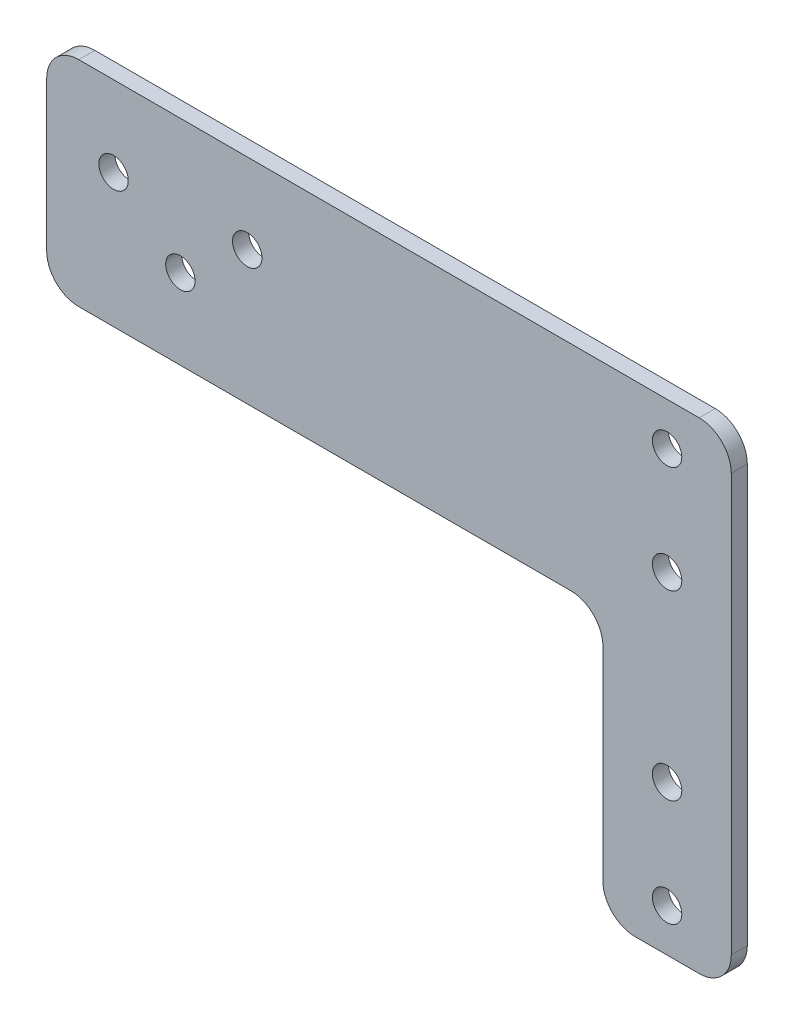
ISO-10303-21;
HEADER;
FILE_DESCRIPTION(('STEP AP214'),'2;1');
FILE_NAME('part.step','',(''),(''),'','','');
FILE_SCHEMA(('AUTOMOTIVE_DESIGN { 1 0 10303 214 1 1 1 1 }'));
ENDSEC;
DATA;
#1=APPLICATION_CONTEXT('core data for automotive mechanical design processes');
#2=APPLICATION_PROTOCOL_DEFINITION('international standard','automotive_design',2000,#1);
#3=PRODUCT_CONTEXT('',#1,'mechanical');
#4=PRODUCT('Part','Part','',(#3));
#5=PRODUCT_RELATED_PRODUCT_CATEGORY('part','',(#4));
#6=PRODUCT_DEFINITION_FORMATION('','',#4);
#7=PRODUCT_DEFINITION_CONTEXT('part definition',#1,'design');
#8=PRODUCT_DEFINITION('design','',#6,#7);
#9=PRODUCT_DEFINITION_SHAPE('','',#8);
#10=(LENGTH_UNIT() NAMED_UNIT(*) SI_UNIT(.MILLI.,.METRE.));
#11=(NAMED_UNIT(*) PLANE_ANGLE_UNIT() SI_UNIT($,.RADIAN.));
#12=(NAMED_UNIT(*) SI_UNIT($,.STERADIAN.) SOLID_ANGLE_UNIT());
#13=UNCERTAINTY_MEASURE_WITH_UNIT(LENGTH_MEASURE(1.E-05),#10,'distance_accuracy_value','');
#14=(GEOMETRIC_REPRESENTATION_CONTEXT(3) GLOBAL_UNCERTAINTY_ASSIGNED_CONTEXT((#13)) GLOBAL_UNIT_ASSIGNED_CONTEXT((#10,
#11,#12)) REPRESENTATION_CONTEXT('',''));
#15=CARTESIAN_POINT('',(0.,0.,0.));
#16=DIRECTION('',(0.,0.,1.));
#17=DIRECTION('',(1.,0.,0.));
#18=AXIS2_PLACEMENT_3D('',#15,#16,#17);
#19=CARTESIAN_POINT('',(0.,-50.,-3.));
#20=DIRECTION('',(-1.,0.,0.));
#21=DIRECTION('',(0.,0.,1.));
#22=AXIS2_PLACEMENT_3D('',#19,#20,#21);
#23=PLANE('',#22);
#24=DIRECTION('',(0.,-1.,0.));
#25=VECTOR('',#24,1.);
#26=CARTESIAN_POINT('',(0.,-50.,-3.));
#27=LINE('',#26,#25);
#28=CARTESIAN_POINT('',(0.,-6.,-3.));
#29=VERTEX_POINT('',#28);
#30=CARTESIAN_POINT('',(0.,-44.,-3.));
#31=VERTEX_POINT('',#30);
#32=EDGE_CURVE('E219',#29,#31,#27,.T.);
#33=ORIENTED_EDGE('',*,*,#32,.T.);
#34=DIRECTION('',(0.,0.,1.));
#35=VECTOR('',#34,1.);
#36=CARTESIAN_POINT('',(0.,-44.,-3.));
#37=LINE('',#36,#35);
#38=CARTESIAN_POINT('',(0.,-44.,0.));
#39=VERTEX_POINT('',#38);
#40=EDGE_CURVE('E186',#31,#39,#37,.T.);
#41=ORIENTED_EDGE('',*,*,#40,.T.);
#42=DIRECTION('',(0.,-1.,0.));
#43=VECTOR('',#42,1.);
#44=CARTESIAN_POINT('',(0.,-50.,0.));
#45=LINE('',#44,#43);
#46=CARTESIAN_POINT('',(0.,-6.,0.));
#47=VERTEX_POINT('',#46);
#48=EDGE_CURVE('E202',#47,#39,#45,.T.);
#49=ORIENTED_EDGE('',*,*,#48,.F.);
#50=DIRECTION('',(0.,0.,1.));
#51=VECTOR('',#50,1.);
#52=CARTESIAN_POINT('',(0.,-6.,-3.));
#53=LINE('',#52,#51);
#54=EDGE_CURVE('E188',#47,#29,#53,.F.);
#55=ORIENTED_EDGE('',*,*,#54,.T.);
#56=EDGE_LOOP('',(#33,#41,#49,#55));
#57=FACE_BOUND('',#56,.T.);
#58=ADVANCED_FACE('F41',(#57),#23,.T.);
#59=CARTESIAN_POINT('',(0.,0.,-3.));
#60=DIRECTION('',(0.,-1.,0.));
#61=DIRECTION('',(1.,0.,0.));
#62=AXIS2_PLACEMENT_3D('',#59,#60,#61);
#63=PLANE('',#62);
#64=DIRECTION('',(1.,0.,0.));
#65=VECTOR('',#64,1.);
#66=CARTESIAN_POINT('',(0.,0.,-3.));
#67=LINE('',#66,#65);
#68=CARTESIAN_POINT('',(-98.,0.,-3.));
#69=VERTEX_POINT('',#68);
#70=CARTESIAN_POINT('',(-6.,0.,-3.));
#71=VERTEX_POINT('',#70);
#72=EDGE_CURVE('E151',#69,#71,#67,.T.);
#73=ORIENTED_EDGE('',*,*,#72,.T.);
#74=DIRECTION('',(0.,0.,1.));
#75=VECTOR('',#74,1.);
#76=CARTESIAN_POINT('',(-6.,0.,0.));
#77=LINE('',#76,#75);
#78=CARTESIAN_POINT('',(-6.,0.,0.));
#79=VERTEX_POINT('',#78);
#80=EDGE_CURVE('E193',#71,#79,#77,.T.);
#81=ORIENTED_EDGE('',*,*,#80,.T.);
#82=DIRECTION('',(1.,0.,0.));
#83=VECTOR('',#82,1.);
#84=CARTESIAN_POINT('',(0.,0.,0.));
#85=LINE('',#84,#83);
#86=CARTESIAN_POINT('',(-98.,0.,0.));
#87=VERTEX_POINT('',#86);
#88=EDGE_CURVE('E161',#87,#79,#85,.T.);
#89=ORIENTED_EDGE('',*,*,#88,.F.);
#90=DIRECTION('',(0.,0.,1.));
#91=VECTOR('',#90,1.);
#92=CARTESIAN_POINT('',(-98.,0.,-3.));
#93=LINE('',#92,#91);
#94=EDGE_CURVE('E191',#87,#69,#93,.F.);
#95=ORIENTED_EDGE('',*,*,#94,.T.);
#96=EDGE_LOOP('',(#73,#81,#89,#95));
#97=FACE_BOUND('',#96,.T.);
#98=ADVANCED_FACE('F225',(#97),#63,.T.);
#99=CARTESIAN_POINT('',(-104.,0.,-3.));
#100=DIRECTION('',(-1.,0.,0.));
#101=DIRECTION('',(0.,0.,1.));
#102=AXIS2_PLACEMENT_3D('',#99,#100,#101);
#103=PLANE('',#102);
#104=DIRECTION('',(0.,-1.,0.));
#105=VECTOR('',#104,1.);
#106=CARTESIAN_POINT('',(-104.,0.,-3.));
#107=LINE('',#106,#105);
#108=CARTESIAN_POINT('',(-104.,34.,-3.));
#109=VERTEX_POINT('',#108);
#110=CARTESIAN_POINT('',(-104.,5.99999999999999,-3.));
#111=VERTEX_POINT('',#110);
#112=EDGE_CURVE('E156',#109,#111,#107,.T.);
#113=ORIENTED_EDGE('',*,*,#112,.T.);
#114=DIRECTION('',(0.,0.,1.));
#115=VECTOR('',#114,1.);
#116=CARTESIAN_POINT('',(-104.,5.99999999999999,-3.));
#117=LINE('',#116,#115);
#118=CARTESIAN_POINT('',(-104.,5.99999999999999,0.));
#119=VERTEX_POINT('',#118);
#120=EDGE_CURVE('E198',#111,#119,#117,.T.);
#121=ORIENTED_EDGE('',*,*,#120,.T.);
#122=DIRECTION('',(0.,-1.,0.));
#123=VECTOR('',#122,1.);
#124=CARTESIAN_POINT('',(-104.,0.,0.));
#125=LINE('',#124,#123);
#126=CARTESIAN_POINT('',(-104.,34.,0.));
#127=VERTEX_POINT('',#126);
#128=EDGE_CURVE('E242',#127,#119,#125,.T.);
#129=ORIENTED_EDGE('',*,*,#128,.F.);
#130=DIRECTION('',(0.,0.,1.));
#131=VECTOR('',#130,1.);
#132=CARTESIAN_POINT('',(-104.,34.,-3.));
#133=LINE('',#132,#131);
#134=EDGE_CURVE('E196',#127,#109,#133,.F.);
#135=ORIENTED_EDGE('',*,*,#134,.T.);
#136=EDGE_LOOP('',(#113,#121,#129,#135));
#137=FACE_BOUND('',#136,.T.);
#138=ADVANCED_FACE('F232',(#137),#103,.T.);
#139=CARTESIAN_POINT('',(-104.,40.,-3.));
#140=DIRECTION('',(0.,1.,0.));
#141=DIRECTION('',(0.,0.,1.));
#142=AXIS2_PLACEMENT_3D('',#139,#140,#141);
#143=PLANE('',#142);
#144=DIRECTION('',(-1.,0.,0.));
#145=VECTOR('',#144,1.);
#146=CARTESIAN_POINT('',(-104.,40.,0.));
#147=LINE('',#146,#145);
#148=CARTESIAN_POINT('',(18.,40.,0.));
#149=VERTEX_POINT('',#148);
#150=CARTESIAN_POINT('',(-98.,40.,0.));
#151=VERTEX_POINT('',#150);
#152=EDGE_CURVE('E149',#149,#151,#147,.T.);
#153=ORIENTED_EDGE('',*,*,#152,.F.);
#154=DIRECTION('',(0.,0.,1.));
#155=VECTOR('',#154,1.);
#156=CARTESIAN_POINT('',(18.,40.,-3.));
#157=LINE('',#156,#155);
#158=CARTESIAN_POINT('',(18.,40.,-3.));
#159=VERTEX_POINT('',#158);
#160=EDGE_CURVE('E175',#149,#159,#157,.F.);
#161=ORIENTED_EDGE('',*,*,#160,.T.);
#162=DIRECTION('',(-1.,0.,0.));
#163=VECTOR('',#162,1.);
#164=CARTESIAN_POINT('',(-104.,40.,-3.));
#165=LINE('',#164,#163);
#166=CARTESIAN_POINT('',(-98.,40.,-3.));
#167=VERTEX_POINT('',#166);
#168=EDGE_CURVE('E233',#159,#167,#165,.T.);
#169=ORIENTED_EDGE('',*,*,#168,.T.);
#170=DIRECTION('',(0.,0.,1.));
#171=VECTOR('',#170,1.);
#172=CARTESIAN_POINT('',(-98.,40.,-3.));
#173=LINE('',#172,#171);
#174=EDGE_CURVE('E167',#167,#151,#173,.T.);
#175=ORIENTED_EDGE('',*,*,#174,.T.);
#176=EDGE_LOOP('',(#153,#161,#169,#175));
#177=FACE_BOUND('',#176,.T.);
#178=ADVANCED_FACE('F258',(#177),#143,.T.);
#179=CARTESIAN_POINT('',(24.,40.,-3.));
#180=DIRECTION('',(1.,0.,0.));
#181=DIRECTION('',(0.,1.,0.));
#182=AXIS2_PLACEMENT_3D('',#179,#180,#181);
#183=PLANE('',#182);
#184=DIRECTION('',(0.,1.,0.));
#185=VECTOR('',#184,1.);
#186=CARTESIAN_POINT('',(24.,40.,-3.));
#187=LINE('',#186,#185);
#188=CARTESIAN_POINT('',(24.,-44.,-3.));
#189=VERTEX_POINT('',#188);
#190=CARTESIAN_POINT('',(24.,34.,-3.));
#191=VERTEX_POINT('',#190);
#192=EDGE_CURVE('E239',#189,#191,#187,.T.);
#193=ORIENTED_EDGE('',*,*,#192,.T.);
#194=DIRECTION('',(0.,0.,1.));
#195=VECTOR('',#194,1.);
#196=CARTESIAN_POINT('',(24.,34.,-3.));
#197=LINE('',#196,#195);
#198=CARTESIAN_POINT('',(24.,34.,0.));
#199=VERTEX_POINT('',#198);
#200=EDGE_CURVE('E147',#191,#199,#197,.T.);
#201=ORIENTED_EDGE('',*,*,#200,.T.);
#202=DIRECTION('',(0.,1.,0.));
#203=VECTOR('',#202,1.);
#204=CARTESIAN_POINT('',(24.,40.,0.));
#205=LINE('',#204,#203);
#206=CARTESIAN_POINT('',(24.,-44.,0.));
#207=VERTEX_POINT('',#206);
#208=EDGE_CURVE('E131',#207,#199,#205,.T.);
#209=ORIENTED_EDGE('',*,*,#208,.F.);
#210=DIRECTION('',(0.,0.,1.));
#211=VECTOR('',#210,1.);
#212=CARTESIAN_POINT('',(24.,-44.,-3.));
#213=LINE('',#212,#211);
#214=EDGE_CURVE('E150',#207,#189,#213,.F.);
#215=ORIENTED_EDGE('',*,*,#214,.T.);
#216=EDGE_LOOP('',(#193,#201,#209,#215));
#217=FACE_BOUND('',#216,.T.);
#218=ADVANCED_FACE('F146',(#217),#183,.T.);
#219=CARTESIAN_POINT('',(24.,-50.,-3.));
#220=DIRECTION('',(0.,-1.,0.));
#221=DIRECTION('',(0.,0.,-1.));
#222=AXIS2_PLACEMENT_3D('',#219,#220,#221);
#223=PLANE('',#222);
#224=DIRECTION('',(1.,0.,0.));
#225=VECTOR('',#224,1.);
#226=CARTESIAN_POINT('',(24.,-50.,-3.));
#227=LINE('',#226,#225);
#228=CARTESIAN_POINT('',(6.,-50.,-3.));
#229=VERTEX_POINT('',#228);
#230=CARTESIAN_POINT('',(18.,-50.,-3.));
#231=VERTEX_POINT('',#230);
#232=EDGE_CURVE('E244',#229,#231,#227,.T.);
#233=ORIENTED_EDGE('',*,*,#232,.T.);
#234=DIRECTION('',(0.,0.,1.));
#235=VECTOR('',#234,1.);
#236=CARTESIAN_POINT('',(18.,-50.,-3.));
#237=LINE('',#236,#235);
#238=CARTESIAN_POINT('',(18.,-50.,0.));
#239=VERTEX_POINT('',#238);
#240=EDGE_CURVE('E185',#231,#239,#237,.T.);
#241=ORIENTED_EDGE('',*,*,#240,.T.);
#242=DIRECTION('',(1.,0.,0.));
#243=VECTOR('',#242,1.);
#244=CARTESIAN_POINT('',(24.,-50.,0.));
#245=LINE('',#244,#243);
#246=CARTESIAN_POINT('',(6.,-50.,0.));
#247=VERTEX_POINT('',#246);
#248=EDGE_CURVE('E133',#247,#239,#245,.T.);
#249=ORIENTED_EDGE('',*,*,#248,.F.);
#250=DIRECTION('',(0.,0.,1.));
#251=VECTOR('',#250,1.);
#252=CARTESIAN_POINT('',(6.,-50.,-3.));
#253=LINE('',#252,#251);
#254=EDGE_CURVE('E64',#247,#229,#253,.F.);
#255=ORIENTED_EDGE('',*,*,#254,.T.);
#256=EDGE_LOOP('',(#233,#241,#249,#255));
#257=FACE_BOUND('',#256,.T.);
#258=ADVANCED_FACE('F275',(#257),#223,.T.);
#259=CARTESIAN_POINT('',(0.,0.,-3.));
#260=DIRECTION('',(0.,0.,1.));
#261=DIRECTION('',(1.,0.,0.));
#262=AXIS2_PLACEMENT_3D('',#259,#260,#261);
#263=PLANE('',#262);
#264=CARTESIAN_POINT('',(12.,-42.,-3.));
#265=DIRECTION('',(0.,0.,1.));
#266=DIRECTION('',(1.,0.,0.));
#267=AXIS2_PLACEMENT_3D('',#264,#265,#266);
#268=CIRCLE('',#267,2.75);
#269=CARTESIAN_POINT('',(14.75,-42.,-3.));
#270=VERTEX_POINT('',#269);
#271=EDGE_CURVE('E460',#270,#270,#268,.T.);
#272=ORIENTED_EDGE('',*,*,#271,.T.);
#273=EDGE_LOOP('',(#272));
#274=FACE_BOUND('',#273,.T.);
#275=CARTESIAN_POINT('',(12.,-22.,-3.));
#276=DIRECTION('',(0.,0.,1.));
#277=DIRECTION('',(1.,0.,0.));
#278=AXIS2_PLACEMENT_3D('',#275,#276,#277);
#279=CIRCLE('',#278,2.75);
#280=CARTESIAN_POINT('',(14.75,-22.,-3.));
#281=VERTEX_POINT('',#280);
#282=EDGE_CURVE('E461',#281,#281,#279,.T.);
#283=ORIENTED_EDGE('',*,*,#282,.T.);
#284=EDGE_LOOP('',(#283));
#285=FACE_BOUND('',#284,.T.);
#286=CARTESIAN_POINT('',(12.,12.,-3.));
#287=DIRECTION('',(0.,0.,1.));
#288=DIRECTION('',(1.,0.,0.));
#289=AXIS2_PLACEMENT_3D('',#286,#287,#288);
#290=CIRCLE('',#289,2.75);
#291=CARTESIAN_POINT('',(14.75,12.,-3.));
#292=VERTEX_POINT('',#291);
#293=EDGE_CURVE('E465',#292,#292,#290,.T.);
#294=ORIENTED_EDGE('',*,*,#293,.T.);
#295=EDGE_LOOP('',(#294));
#296=FACE_BOUND('',#295,.T.);
#297=CARTESIAN_POINT('',(12.,32.,-3.));
#298=DIRECTION('',(0.,0.,1.));
#299=DIRECTION('',(1.,0.,0.));
#300=AXIS2_PLACEMENT_3D('',#297,#298,#299);
#301=CIRCLE('',#300,2.75);
#302=CARTESIAN_POINT('',(14.75,32.,-3.));
#303=VERTEX_POINT('',#302);
#304=EDGE_CURVE('E467',#303,#303,#301,.T.);
#305=ORIENTED_EDGE('',*,*,#304,.T.);
#306=EDGE_LOOP('',(#305));
#307=FACE_BOUND('',#306,.T.);
#308=CARTESIAN_POINT('',(-91.5,25.,-3.));
#309=DIRECTION('',(0.,0.,1.));
#310=DIRECTION('',(1.,0.,0.));
#311=AXIS2_PLACEMENT_3D('',#308,#309,#310);
#312=CIRCLE('',#311,2.75);
#313=CARTESIAN_POINT('',(-88.75,25.,-3.));
#314=VERTEX_POINT('',#313);
#315=EDGE_CURVE('E473',#314,#314,#312,.T.);
#316=ORIENTED_EDGE('',*,*,#315,.T.);
#317=EDGE_LOOP('',(#316));
#318=FACE_BOUND('',#317,.T.);
#319=CARTESIAN_POINT('',(-66.5,25.,-3.));
#320=DIRECTION('',(0.,0.,1.));
#321=DIRECTION('',(1.,0.,0.));
#322=AXIS2_PLACEMENT_3D('',#319,#320,#321);
#323=CIRCLE('',#322,2.75);
#324=CARTESIAN_POINT('',(-63.75,25.,-3.));
#325=VERTEX_POINT('',#324);
#326=EDGE_CURVE('E480',#325,#325,#323,.T.);
#327=ORIENTED_EDGE('',*,*,#326,.T.);
#328=EDGE_LOOP('',(#327));
#329=FACE_BOUND('',#328,.T.);
#330=CARTESIAN_POINT('',(-79.,15.,-3.));
#331=DIRECTION('',(0.,0.,1.));
#332=DIRECTION('',(1.,0.,0.));
#333=AXIS2_PLACEMENT_3D('',#330,#331,#332);
#334=CIRCLE('',#333,2.75);
#335=CARTESIAN_POINT('',(-76.25,15.,-3.));
#336=VERTEX_POINT('',#335);
#337=EDGE_CURVE('E212',#336,#336,#334,.T.);
#338=ORIENTED_EDGE('',*,*,#337,.T.);
#339=EDGE_LOOP('',(#338));
#340=FACE_BOUND('',#339,.T.);
#341=ORIENTED_EDGE('',*,*,#168,.F.);
#342=CARTESIAN_POINT('',(18.,34.,-3.));
#343=DIRECTION('',(0.,0.,1.));
#344=DIRECTION('',(1.,0.,0.));
#345=AXIS2_PLACEMENT_3D('',#342,#343,#344);
#346=CIRCLE('',#345,6.);
#347=EDGE_CURVE('E183',#159,#191,#346,.F.);
#348=ORIENTED_EDGE('',*,*,#347,.T.);
#349=ORIENTED_EDGE('',*,*,#192,.F.);
#350=CARTESIAN_POINT('',(18.,-44.,-3.));
#351=DIRECTION('',(0.,0.,1.));
#352=DIRECTION('',(1.,0.,0.));
#353=AXIS2_PLACEMENT_3D('',#350,#351,#352);
#354=CIRCLE('',#353,6.);
#355=EDGE_CURVE('E57',#189,#231,#354,.F.);
#356=ORIENTED_EDGE('',*,*,#355,.T.);
#357=ORIENTED_EDGE('',*,*,#232,.F.);
#358=CARTESIAN_POINT('',(6.,-44.,-3.));
#359=DIRECTION('',(0.,0.,1.));
#360=DIRECTION('',(1.,0.,0.));
#361=AXIS2_PLACEMENT_3D('',#358,#359,#360);
#362=CIRCLE('',#361,6.);
#363=EDGE_CURVE('E176',#229,#31,#362,.F.);
#364=ORIENTED_EDGE('',*,*,#363,.T.);
#365=ORIENTED_EDGE('',*,*,#32,.F.);
#366=CARTESIAN_POINT('',(-6.,-6.,-3.));
#367=DIRECTION('',(0.,0.,1.));
#368=DIRECTION('',(1.,0.,0.));
#369=AXIS2_PLACEMENT_3D('',#366,#367,#368);
#370=CIRCLE('',#369,6.);
#371=EDGE_CURVE('E11',#29,#71,#370,.T.);
#372=ORIENTED_EDGE('',*,*,#371,.T.);
#373=ORIENTED_EDGE('',*,*,#72,.F.);
#374=CARTESIAN_POINT('',(-98.,5.99999999999999,-3.));
#375=DIRECTION('',(0.,0.,1.));
#376=DIRECTION('',(1.,0.,0.));
#377=AXIS2_PLACEMENT_3D('',#374,#375,#376);
#378=CIRCLE('',#377,6.);
#379=EDGE_CURVE('E178',#69,#111,#378,.F.);
#380=ORIENTED_EDGE('',*,*,#379,.T.);
#381=ORIENTED_EDGE('',*,*,#112,.F.);
#382=CARTESIAN_POINT('',(-98.,34.,-3.));
#383=DIRECTION('',(0.,0.,1.));
#384=DIRECTION('',(1.,0.,0.));
#385=AXIS2_PLACEMENT_3D('',#382,#383,#384);
#386=CIRCLE('',#385,6.);
#387=EDGE_CURVE('E172',#109,#167,#386,.F.);
#388=ORIENTED_EDGE('',*,*,#387,.T.);
#389=EDGE_LOOP('',(#341,#348,#349,#356,#357,#364,#365,#372,#373,#380,#381,#388));
#390=FACE_BOUND('',#389,.T.);
#391=ADVANCED_FACE('F218',(#274,#285,#296,#307,#318,#329,#340,#390),#263,.F.);
#392=CARTESIAN_POINT('',(0.,0.,0.));
#393=DIRECTION('',(0.,0.,1.));
#394=DIRECTION('',(1.,0.,0.));
#395=AXIS2_PLACEMENT_3D('',#392,#393,#394);
#396=PLANE('',#395);
#397=CARTESIAN_POINT('',(12.,-42.,0.));
#398=DIRECTION('',(0.,0.,1.));
#399=DIRECTION('',(1.,0.,0.));
#400=AXIS2_PLACEMENT_3D('',#397,#398,#399);
#401=CIRCLE('',#400,2.75);
#402=CARTESIAN_POINT('',(14.75,-42.,0.));
#403=VERTEX_POINT('',#402);
#404=EDGE_CURVE('E507',#403,#403,#401,.T.);
#405=ORIENTED_EDGE('',*,*,#404,.F.);
#406=EDGE_LOOP('',(#405));
#407=FACE_BOUND('',#406,.T.);
#408=CARTESIAN_POINT('',(12.,-22.,0.));
#409=DIRECTION('',(0.,0.,1.));
#410=DIRECTION('',(1.,0.,0.));
#411=AXIS2_PLACEMENT_3D('',#408,#409,#410);
#412=CIRCLE('',#411,2.75);
#413=CARTESIAN_POINT('',(14.75,-22.,0.));
#414=VERTEX_POINT('',#413);
#415=EDGE_CURVE('E505',#414,#414,#412,.T.);
#416=ORIENTED_EDGE('',*,*,#415,.F.);
#417=EDGE_LOOP('',(#416));
#418=FACE_BOUND('',#417,.T.);
#419=CARTESIAN_POINT('',(12.,12.,0.));
#420=DIRECTION('',(0.,0.,1.));
#421=DIRECTION('',(1.,0.,0.));
#422=AXIS2_PLACEMENT_3D('',#419,#420,#421);
#423=CIRCLE('',#422,2.75);
#424=CARTESIAN_POINT('',(14.75,12.,0.));
#425=VERTEX_POINT('',#424);
#426=EDGE_CURVE('E498',#425,#425,#423,.T.);
#427=ORIENTED_EDGE('',*,*,#426,.F.);
#428=EDGE_LOOP('',(#427));
#429=FACE_BOUND('',#428,.T.);
#430=CARTESIAN_POINT('',(12.,32.,0.));
#431=DIRECTION('',(0.,0.,1.));
#432=DIRECTION('',(1.,0.,0.));
#433=AXIS2_PLACEMENT_3D('',#430,#431,#432);
#434=CIRCLE('',#433,2.75);
#435=CARTESIAN_POINT('',(14.75,32.,0.));
#436=VERTEX_POINT('',#435);
#437=EDGE_CURVE('E492',#436,#436,#434,.T.);
#438=ORIENTED_EDGE('',*,*,#437,.F.);
#439=EDGE_LOOP('',(#438));
#440=FACE_BOUND('',#439,.T.);
#441=CARTESIAN_POINT('',(-91.5,25.,0.));
#442=DIRECTION('',(0.,0.,1.));
#443=DIRECTION('',(1.,0.,0.));
#444=AXIS2_PLACEMENT_3D('',#441,#442,#443);
#445=CIRCLE('',#444,2.75);
#446=CARTESIAN_POINT('',(-88.75,25.,0.));
#447=VERTEX_POINT('',#446);
#448=EDGE_CURVE('E487',#447,#447,#445,.T.);
#449=ORIENTED_EDGE('',*,*,#448,.F.);
#450=EDGE_LOOP('',(#449));
#451=FACE_BOUND('',#450,.T.);
#452=CARTESIAN_POINT('',(-66.5,25.,0.));
#453=DIRECTION('',(0.,0.,1.));
#454=DIRECTION('',(1.,0.,0.));
#455=AXIS2_PLACEMENT_3D('',#452,#453,#454);
#456=CIRCLE('',#455,2.75);
#457=CARTESIAN_POINT('',(-63.75,25.,0.));
#458=VERTEX_POINT('',#457);
#459=EDGE_CURVE('E485',#458,#458,#456,.T.);
#460=ORIENTED_EDGE('',*,*,#459,.F.);
#461=EDGE_LOOP('',(#460));
#462=FACE_BOUND('',#461,.T.);
#463=CARTESIAN_POINT('',(-79.,15.,0.));
#464=DIRECTION('',(0.,0.,1.));
#465=DIRECTION('',(1.,0.,0.));
#466=AXIS2_PLACEMENT_3D('',#463,#464,#465);
#467=CIRCLE('',#466,2.75);
#468=CARTESIAN_POINT('',(-76.25,15.,0.));
#469=VERTEX_POINT('',#468);
#470=EDGE_CURVE('E477',#469,#469,#467,.T.);
#471=ORIENTED_EDGE('',*,*,#470,.F.);
#472=EDGE_LOOP('',(#471));
#473=FACE_BOUND('',#472,.T.);
#474=ORIENTED_EDGE('',*,*,#208,.T.);
#475=CARTESIAN_POINT('',(18.,34.,0.));
#476=DIRECTION('',(0.,0.,1.));
#477=DIRECTION('',(1.,0.,0.));
#478=AXIS2_PLACEMENT_3D('',#475,#476,#477);
#479=CIRCLE('',#478,6.);
#480=EDGE_CURVE('E140',#199,#149,#479,.T.);
#481=ORIENTED_EDGE('',*,*,#480,.T.);
#482=ORIENTED_EDGE('',*,*,#152,.T.);
#483=CARTESIAN_POINT('',(-98.,34.,0.));
#484=DIRECTION('',(0.,0.,1.));
#485=DIRECTION('',(1.,0.,0.));
#486=AXIS2_PLACEMENT_3D('',#483,#484,#485);
#487=CIRCLE('',#486,6.);
#488=EDGE_CURVE('E154',#151,#127,#487,.T.);
#489=ORIENTED_EDGE('',*,*,#488,.T.);
#490=ORIENTED_EDGE('',*,*,#128,.T.);
#491=CARTESIAN_POINT('',(-98.,5.99999999999999,0.));
#492=DIRECTION('',(0.,0.,1.));
#493=DIRECTION('',(1.,0.,0.));
#494=AXIS2_PLACEMENT_3D('',#491,#492,#493);
#495=CIRCLE('',#494,6.);
#496=EDGE_CURVE('E165',#119,#87,#495,.T.);
#497=ORIENTED_EDGE('',*,*,#496,.T.);
#498=ORIENTED_EDGE('',*,*,#88,.T.);
#499=CARTESIAN_POINT('',(-6.,-6.,0.));
#500=DIRECTION('',(0.,0.,1.));
#501=DIRECTION('',(1.,0.,0.));
#502=AXIS2_PLACEMENT_3D('',#499,#500,#501);
#503=CIRCLE('',#502,6.);
#504=EDGE_CURVE('E47',#79,#47,#503,.F.);
#505=ORIENTED_EDGE('',*,*,#504,.T.);
#506=ORIENTED_EDGE('',*,*,#48,.T.);
#507=CARTESIAN_POINT('',(6.,-44.,0.));
#508=DIRECTION('',(0.,0.,1.));
#509=DIRECTION('',(1.,0.,0.));
#510=AXIS2_PLACEMENT_3D('',#507,#508,#509);
#511=CIRCLE('',#510,6.);
#512=EDGE_CURVE('E141',#39,#247,#511,.T.);
#513=ORIENTED_EDGE('',*,*,#512,.T.);
#514=ORIENTED_EDGE('',*,*,#248,.T.);
#515=CARTESIAN_POINT('',(18.,-44.,0.));
#516=DIRECTION('',(0.,0.,1.));
#517=DIRECTION('',(1.,0.,0.));
#518=AXIS2_PLACEMENT_3D('',#515,#516,#517);
#519=CIRCLE('',#518,6.);
#520=EDGE_CURVE('E132',#239,#207,#519,.T.);
#521=ORIENTED_EDGE('',*,*,#520,.T.);
#522=EDGE_LOOP('',(#474,#481,#482,#489,#490,#497,#498,#505,#506,#513,#514,#521));
#523=FACE_BOUND('',#522,.T.);
#524=ADVANCED_FACE('F134',(#407,#418,#429,#440,#451,#462,#473,#523),#396,.T.);
#525=CARTESIAN_POINT('',(-79.,15.,0.));
#526=DIRECTION('',(0.,0.,1.));
#527=DIRECTION('',(1.,0.,0.));
#528=AXIS2_PLACEMENT_3D('',#525,#526,#527);
#529=CYLINDRICAL_SURFACE('',#528,2.75);
#530=ORIENTED_EDGE('',*,*,#337,.F.);
#531=EDGE_LOOP('',(#530));
#532=FACE_BOUND('',#531,.T.);
#533=ORIENTED_EDGE('',*,*,#470,.T.);
#534=EDGE_LOOP('',(#533));
#535=FACE_BOUND('',#534,.T.);
#536=ADVANCED_FACE('F365',(#532,#535),#529,.F.);
#537=CARTESIAN_POINT('',(-66.5,25.,0.));
#538=DIRECTION('',(0.,0.,1.));
#539=DIRECTION('',(1.,0.,0.));
#540=AXIS2_PLACEMENT_3D('',#537,#538,#539);
#541=CYLINDRICAL_SURFACE('',#540,2.75);
#542=ORIENTED_EDGE('',*,*,#326,.F.);
#543=EDGE_LOOP('',(#542));
#544=FACE_BOUND('',#543,.T.);
#545=ORIENTED_EDGE('',*,*,#459,.T.);
#546=EDGE_LOOP('',(#545));
#547=FACE_BOUND('',#546,.T.);
#548=ADVANCED_FACE('F357',(#544,#547),#541,.F.);
#549=CARTESIAN_POINT('',(-91.5,25.,0.));
#550=DIRECTION('',(0.,0.,1.));
#551=DIRECTION('',(1.,0.,0.));
#552=AXIS2_PLACEMENT_3D('',#549,#550,#551);
#553=CYLINDRICAL_SURFACE('',#552,2.75);
#554=ORIENTED_EDGE('',*,*,#315,.F.);
#555=EDGE_LOOP('',(#554));
#556=FACE_BOUND('',#555,.T.);
#557=ORIENTED_EDGE('',*,*,#448,.T.);
#558=EDGE_LOOP('',(#557));
#559=FACE_BOUND('',#558,.T.);
#560=ADVANCED_FACE('F350',(#556,#559),#553,.F.);
#561=CARTESIAN_POINT('',(12.,32.,0.));
#562=DIRECTION('',(0.,0.,1.));
#563=DIRECTION('',(1.,0.,0.));
#564=AXIS2_PLACEMENT_3D('',#561,#562,#563);
#565=CYLINDRICAL_SURFACE('',#564,2.75);
#566=ORIENTED_EDGE('',*,*,#304,.F.);
#567=EDGE_LOOP('',(#566));
#568=FACE_BOUND('',#567,.T.);
#569=ORIENTED_EDGE('',*,*,#437,.T.);
#570=EDGE_LOOP('',(#569));
#571=FACE_BOUND('',#570,.T.);
#572=ADVANCED_FACE('F336',(#568,#571),#565,.F.);
#573=CARTESIAN_POINT('',(12.,12.,0.));
#574=DIRECTION('',(0.,0.,1.));
#575=DIRECTION('',(1.,0.,0.));
#576=AXIS2_PLACEMENT_3D('',#573,#574,#575);
#577=CYLINDRICAL_SURFACE('',#576,2.75);
#578=ORIENTED_EDGE('',*,*,#293,.F.);
#579=EDGE_LOOP('',(#578));
#580=FACE_BOUND('',#579,.T.);
#581=ORIENTED_EDGE('',*,*,#426,.T.);
#582=EDGE_LOOP('',(#581));
#583=FACE_BOUND('',#582,.T.);
#584=ADVANCED_FACE('F329',(#580,#583),#577,.F.);
#585=CARTESIAN_POINT('',(12.,-22.,0.));
#586=DIRECTION('',(0.,0.,1.));
#587=DIRECTION('',(1.,0.,0.));
#588=AXIS2_PLACEMENT_3D('',#585,#586,#587);
#589=CYLINDRICAL_SURFACE('',#588,2.75);
#590=ORIENTED_EDGE('',*,*,#282,.F.);
#591=EDGE_LOOP('',(#590));
#592=FACE_BOUND('',#591,.T.);
#593=ORIENTED_EDGE('',*,*,#415,.T.);
#594=EDGE_LOOP('',(#593));
#595=FACE_BOUND('',#594,.T.);
#596=ADVANCED_FACE('F319',(#592,#595),#589,.F.);
#597=CARTESIAN_POINT('',(12.,-42.,0.));
#598=DIRECTION('',(0.,0.,1.));
#599=DIRECTION('',(1.,0.,0.));
#600=AXIS2_PLACEMENT_3D('',#597,#598,#599);
#601=CYLINDRICAL_SURFACE('',#600,2.75);
#602=ORIENTED_EDGE('',*,*,#271,.F.);
#603=EDGE_LOOP('',(#602));
#604=FACE_BOUND('',#603,.T.);
#605=ORIENTED_EDGE('',*,*,#404,.T.);
#606=EDGE_LOOP('',(#605));
#607=FACE_BOUND('',#606,.T.);
#608=ADVANCED_FACE('F276',(#604,#607),#601,.F.);
#609=CARTESIAN_POINT('',(18.,34.,-3.));
#610=DIRECTION('',(0.,0.,1.));
#611=DIRECTION('',(1.,0.,0.));
#612=AXIS2_PLACEMENT_3D('',#609,#610,#611);
#613=CYLINDRICAL_SURFACE('',#612,6.);
#614=ORIENTED_EDGE('',*,*,#347,.F.);
#615=ORIENTED_EDGE('',*,*,#160,.F.);
#616=ORIENTED_EDGE('',*,*,#480,.F.);
#617=ORIENTED_EDGE('',*,*,#200,.F.);
#618=EDGE_LOOP('',(#614,#615,#616,#617));
#619=FACE_BOUND('',#618,.T.);
#620=ADVANCED_FACE('F255',(#619),#613,.T.);
#621=CARTESIAN_POINT('',(18.,-44.,-3.));
#622=DIRECTION('',(0.,0.,1.));
#623=DIRECTION('',(1.,0.,0.));
#624=AXIS2_PLACEMENT_3D('',#621,#622,#623);
#625=CYLINDRICAL_SURFACE('',#624,6.);
#626=ORIENTED_EDGE('',*,*,#355,.F.);
#627=ORIENTED_EDGE('',*,*,#214,.F.);
#628=ORIENTED_EDGE('',*,*,#520,.F.);
#629=ORIENTED_EDGE('',*,*,#240,.F.);
#630=EDGE_LOOP('',(#626,#627,#628,#629));
#631=FACE_BOUND('',#630,.T.);
#632=ADVANCED_FACE('F155',(#631),#625,.T.);
#633=CARTESIAN_POINT('',(6.,-44.,-3.));
#634=DIRECTION('',(0.,0.,1.));
#635=DIRECTION('',(1.,0.,0.));
#636=AXIS2_PLACEMENT_3D('',#633,#634,#635);
#637=CYLINDRICAL_SURFACE('',#636,6.);
#638=ORIENTED_EDGE('',*,*,#363,.F.);
#639=ORIENTED_EDGE('',*,*,#254,.F.);
#640=ORIENTED_EDGE('',*,*,#512,.F.);
#641=ORIENTED_EDGE('',*,*,#40,.F.);
#642=EDGE_LOOP('',(#638,#639,#640,#641));
#643=FACE_BOUND('',#642,.T.);
#644=ADVANCED_FACE('F278',(#643),#637,.T.);
#645=CARTESIAN_POINT('',(-6.,-6.,-3.));
#646=DIRECTION('',(0.,0.,-1.));
#647=DIRECTION('',(-1.,0.,0.));
#648=AXIS2_PLACEMENT_3D('',#645,#646,#647);
#649=CYLINDRICAL_SURFACE('',#648,6.);
#650=ORIENTED_EDGE('',*,*,#371,.F.);
#651=ORIENTED_EDGE('',*,*,#54,.F.);
#652=ORIENTED_EDGE('',*,*,#504,.F.);
#653=ORIENTED_EDGE('',*,*,#80,.F.);
#654=EDGE_LOOP('',(#650,#651,#652,#653));
#655=FACE_BOUND('',#654,.T.);
#656=ADVANCED_FACE('F215',(#655),#649,.F.);
#657=CARTESIAN_POINT('',(-98.,5.99999999999999,-3.));
#658=DIRECTION('',(0.,0.,1.));
#659=DIRECTION('',(1.,0.,0.));
#660=AXIS2_PLACEMENT_3D('',#657,#658,#659);
#661=CYLINDRICAL_SURFACE('',#660,6.);
#662=ORIENTED_EDGE('',*,*,#379,.F.);
#663=ORIENTED_EDGE('',*,*,#94,.F.);
#664=ORIENTED_EDGE('',*,*,#496,.F.);
#665=ORIENTED_EDGE('',*,*,#120,.F.);
#666=EDGE_LOOP('',(#662,#663,#664,#665));
#667=FACE_BOUND('',#666,.T.);
#668=ADVANCED_FACE('F224',(#667),#661,.T.);
#669=CARTESIAN_POINT('',(-98.,34.,-3.));
#670=DIRECTION('',(0.,0.,1.));
#671=DIRECTION('',(1.,0.,0.));
#672=AXIS2_PLACEMENT_3D('',#669,#670,#671);
#673=CYLINDRICAL_SURFACE('',#672,6.);
#674=ORIENTED_EDGE('',*,*,#387,.F.);
#675=ORIENTED_EDGE('',*,*,#134,.F.);
#676=ORIENTED_EDGE('',*,*,#488,.F.);
#677=ORIENTED_EDGE('',*,*,#174,.F.);
#678=EDGE_LOOP('',(#674,#675,#676,#677));
#679=FACE_BOUND('',#678,.T.);
#680=ADVANCED_FACE('F43',(#679),#673,.T.);
#681=CLOSED_SHELL('',(#58,#98,#138,#178,#218,#258,#391,#524,#536,#548,#560,#572,#584,#596,#608,
#620,#632,#644,#656,#668,#680));
#682=MANIFOLD_SOLID_BREP('B2',#681);
#683=ADVANCED_BREP_SHAPE_REPRESENTATION('',(#18,#682),#14);
#684=SHAPE_DEFINITION_REPRESENTATION(#9,#683);
ENDSEC;
END-ISO-10303-21;
